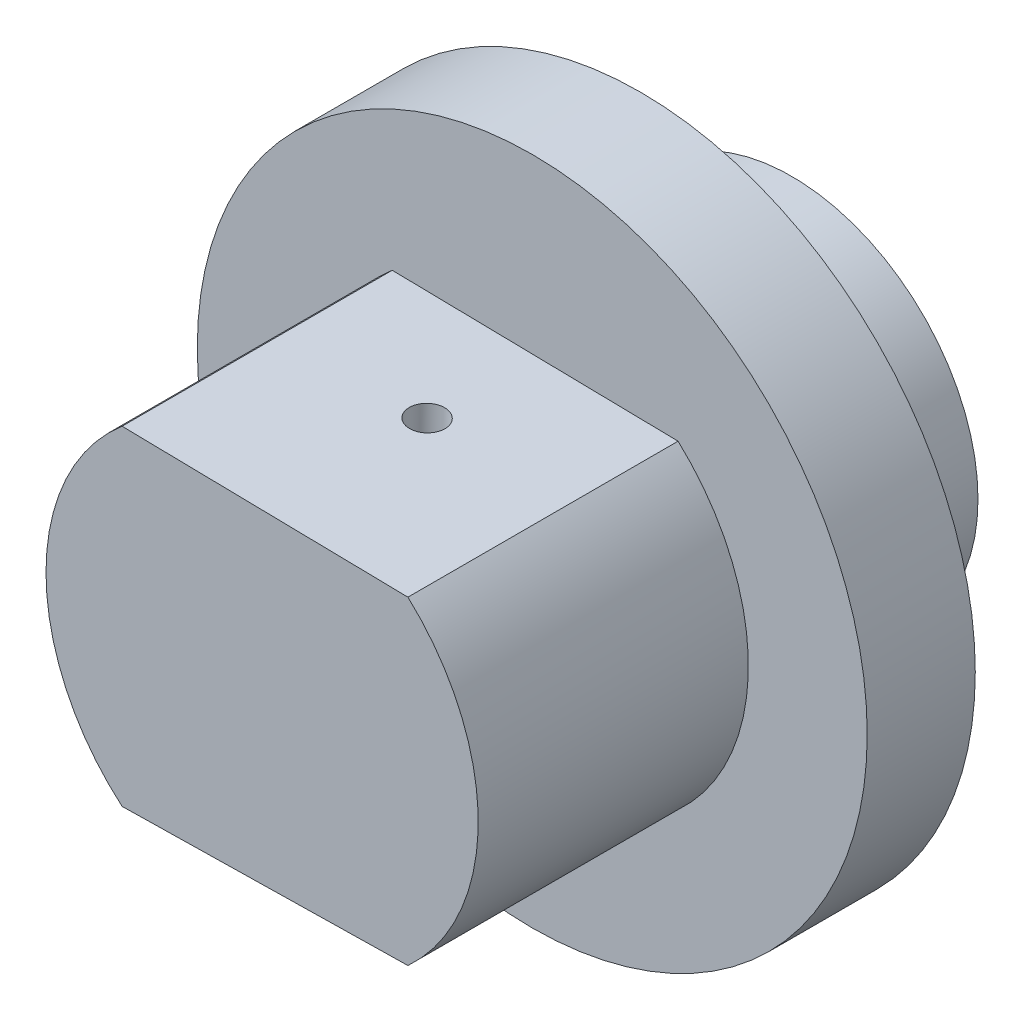
ISO-10303-21;
HEADER;
FILE_DESCRIPTION(('STEP AP214'),'2;1');
FILE_NAME('part.step','',(''),(''),'','','');
FILE_SCHEMA(('AUTOMOTIVE_DESIGN { 1 0 10303 214 1 1 1 1 }'));
ENDSEC;
DATA;
#1=APPLICATION_CONTEXT('core data for automotive mechanical design processes');
#2=APPLICATION_PROTOCOL_DEFINITION('international standard','automotive_design',2000,#1);
#3=PRODUCT_CONTEXT('',#1,'mechanical');
#4=PRODUCT('Part','Part','',(#3));
#5=PRODUCT_RELATED_PRODUCT_CATEGORY('part','',(#4));
#6=PRODUCT_DEFINITION_FORMATION('','',#4);
#7=PRODUCT_DEFINITION_CONTEXT('part definition',#1,'design');
#8=PRODUCT_DEFINITION('design','',#6,#7);
#9=PRODUCT_DEFINITION_SHAPE('','',#8);
#10=(LENGTH_UNIT() NAMED_UNIT(*) SI_UNIT(.MILLI.,.METRE.));
#11=(NAMED_UNIT(*) PLANE_ANGLE_UNIT() SI_UNIT($,.RADIAN.));
#12=(NAMED_UNIT(*) SI_UNIT($,.STERADIAN.) SOLID_ANGLE_UNIT());
#13=UNCERTAINTY_MEASURE_WITH_UNIT(LENGTH_MEASURE(1.E-05),#10,'distance_accuracy_value','');
#14=(GEOMETRIC_REPRESENTATION_CONTEXT(3) GLOBAL_UNCERTAINTY_ASSIGNED_CONTEXT((#13)) GLOBAL_UNIT_ASSIGNED_CONTEXT((#10,
#11,#12)) REPRESENTATION_CONTEXT('',''));
#15=CARTESIAN_POINT('',(0.,0.,0.));
#16=DIRECTION('',(0.,0.,1.));
#17=DIRECTION('',(1.,0.,0.));
#18=AXIS2_PLACEMENT_3D('',#15,#16,#17);
#19=CARTESIAN_POINT('',(0.,0.,14.));
#20=DIRECTION('',(0.,0.,-1.));
#21=DIRECTION('',(-1.,0.,0.));
#22=AXIS2_PLACEMENT_3D('',#19,#20,#21);
#23=CYLINDRICAL_SURFACE('',#22,17.25);
#24=CARTESIAN_POINT('',(0.,0.,14.));
#25=DIRECTION('',(0.,0.,1.));
#26=DIRECTION('',(1.,0.,0.));
#27=AXIS2_PLACEMENT_3D('',#24,#25,#26);
#28=CIRCLE('',#27,17.25);
#29=CARTESIAN_POINT('',(17.25,0.,14.));
#30=VERTEX_POINT('',#29);
#31=EDGE_CURVE('E11',#30,#30,#28,.T.);
#32=ORIENTED_EDGE('',*,*,#31,.F.);
#33=EDGE_LOOP('',(#32));
#34=FACE_BOUND('',#33,.T.);
#35=CARTESIAN_POINT('',(0.,0.,0.));
#36=DIRECTION('',(0.,0.,1.));
#37=DIRECTION('',(1.,0.,0.));
#38=AXIS2_PLACEMENT_3D('',#35,#36,#37);
#39=CIRCLE('',#38,17.25);
#40=CARTESIAN_POINT('',(17.25,0.,0.));
#41=VERTEX_POINT('',#40);
#42=EDGE_CURVE('E49',#41,#41,#39,.T.);
#43=ORIENTED_EDGE('',*,*,#42,.T.);
#44=EDGE_LOOP('',(#43));
#45=FACE_BOUND('',#44,.T.);
#46=ADVANCED_FACE('F41',(#34,#45),#23,.T.);
#47=CARTESIAN_POINT('',(0.,0.,0.));
#48=DIRECTION('',(0.,0.,1.));
#49=DIRECTION('',(1.,0.,0.));
#50=AXIS2_PLACEMENT_3D('',#47,#48,#49);
#51=PLANE('',#50);
#52=DIRECTION('',(-1.,0.,0.));
#53=VECTOR('',#52,1.);
#54=CARTESIAN_POINT('',(0.,10.5,0.));
#55=LINE('',#54,#53);
#56=CARTESIAN_POINT('',(10.5,10.5,0.));
#57=VERTEX_POINT('',#56);
#58=CARTESIAN_POINT('',(-10.5,10.5,0.));
#59=VERTEX_POINT('',#58);
#60=EDGE_CURVE('E174',#57,#59,#55,.T.);
#61=ORIENTED_EDGE('',*,*,#60,.T.);
#62=DIRECTION('',(0.,-1.,0.));
#63=VECTOR('',#62,1.);
#64=CARTESIAN_POINT('',(-10.5,0.,0.));
#65=LINE('',#64,#63);
#66=CARTESIAN_POINT('',(-10.5,-10.5,0.));
#67=VERTEX_POINT('',#66);
#68=EDGE_CURVE('E188',#59,#67,#65,.T.);
#69=ORIENTED_EDGE('',*,*,#68,.T.);
#70=DIRECTION('',(1.,0.,0.));
#71=VECTOR('',#70,1.);
#72=CARTESIAN_POINT('',(0.,-10.5,0.));
#73=LINE('',#72,#71);
#74=CARTESIAN_POINT('',(10.5,-10.5,0.));
#75=VERTEX_POINT('',#74);
#76=EDGE_CURVE('E185',#67,#75,#73,.T.);
#77=ORIENTED_EDGE('',*,*,#76,.T.);
#78=DIRECTION('',(0.,1.,0.));
#79=VECTOR('',#78,1.);
#80=CARTESIAN_POINT('',(10.5,0.,0.));
#81=LINE('',#80,#79);
#82=EDGE_CURVE('E182',#75,#57,#81,.T.);
#83=ORIENTED_EDGE('',*,*,#82,.T.);
#84=EDGE_LOOP('',(#61,#69,#77,#83));
#85=FACE_BOUND('',#84,.T.);
#86=ORIENTED_EDGE('',*,*,#42,.F.);
#87=EDGE_LOOP('',(#86));
#88=FACE_BOUND('',#87,.T.);
#89=ADVANCED_FACE('F200',(#85,#88),#51,.F.);
#90=CARTESIAN_POINT('',(0.,0.,24.));
#91=DIRECTION('',(0.,0.,-1.));
#92=DIRECTION('',(-1.,0.,0.));
#93=AXIS2_PLACEMENT_3D('',#90,#91,#92);
#94=CYLINDRICAL_SURFACE('',#93,31.);
#95=CARTESIAN_POINT('',(0.,0.,24.));
#96=DIRECTION('',(0.,0.,1.));
#97=DIRECTION('',(1.,0.,0.));
#98=AXIS2_PLACEMENT_3D('',#95,#96,#97);
#99=CIRCLE('',#98,31.);
#100=CARTESIAN_POINT('',(31.,0.,24.));
#101=VERTEX_POINT('',#100);
#102=EDGE_CURVE('E192',#101,#101,#99,.T.);
#103=ORIENTED_EDGE('',*,*,#102,.F.);
#104=EDGE_LOOP('',(#103));
#105=FACE_BOUND('',#104,.T.);
#106=CARTESIAN_POINT('',(0.,0.,14.));
#107=DIRECTION('',(0.,0.,1.));
#108=DIRECTION('',(1.,0.,0.));
#109=AXIS2_PLACEMENT_3D('',#106,#107,#108);
#110=CIRCLE('',#109,31.);
#111=CARTESIAN_POINT('',(31.,0.,14.));
#112=VERTEX_POINT('',#111);
#113=EDGE_CURVE('E191',#112,#112,#110,.T.);
#114=ORIENTED_EDGE('',*,*,#113,.T.);
#115=EDGE_LOOP('',(#114));
#116=FACE_BOUND('',#115,.T.);
#117=ADVANCED_FACE('F202',(#105,#116),#94,.T.);
#118=CARTESIAN_POINT('',(0.,0.,24.));
#119=DIRECTION('',(0.,0.,1.));
#120=DIRECTION('',(1.,0.,0.));
#121=AXIS2_PLACEMENT_3D('',#118,#119,#120);
#122=PLANE('',#121);
#123=CARTESIAN_POINT('',(0.,0.,24.));
#124=DIRECTION('',(0.,0.,1.));
#125=DIRECTION('',(1.,0.,0.));
#126=AXIS2_PLACEMENT_3D('',#123,#124,#125);
#127=CIRCLE('',#126,20.);
#128=CARTESIAN_POINT('',(-12.9596371870671,15.2331153734089,24.));
#129=VERTEX_POINT('',#128);
#130=CARTESIAN_POINT('',(-12.9596371870671,-15.2331153734089,24.));
#131=VERTEX_POINT('',#130);
#132=EDGE_CURVE('E65',#129,#131,#127,.T.);
#133=ORIENTED_EDGE('',*,*,#132,.F.);
#134=DIRECTION('',(-0.999841539985387,0.0178015426199193,0.));
#135=VECTOR('',#134,1.);
#136=CARTESIAN_POINT('',(-12.9596371870671,15.2331153734089,24.));
#137=LINE('',#136,#135);
#138=CARTESIAN_POINT('',(13.4936834656647,14.7621308261527,24.));
#139=VERTEX_POINT('',#138);
#140=EDGE_CURVE('E163',#139,#129,#137,.T.);
#141=ORIENTED_EDGE('',*,*,#140,.F.);
#142=CARTESIAN_POINT('',(0.,0.,24.));
#143=DIRECTION('',(0.,0.,1.));
#144=DIRECTION('',(1.,0.,0.));
#145=AXIS2_PLACEMENT_3D('',#142,#143,#144);
#146=CIRCLE('',#145,20.);
#147=CARTESIAN_POINT('',(13.4936834656647,-14.7621308261527,24.));
#148=VERTEX_POINT('',#147);
#149=EDGE_CURVE('E160',#148,#139,#146,.T.);
#150=ORIENTED_EDGE('',*,*,#149,.F.);
#151=DIRECTION('',(0.999841539985387,0.0178015426199193,0.));
#152=VECTOR('',#151,1.);
#153=CARTESIAN_POINT('',(-12.9596371870671,-15.2331153734089,24.));
#154=LINE('',#153,#152);
#155=EDGE_CURVE('E158',#131,#148,#154,.T.);
#156=ORIENTED_EDGE('',*,*,#155,.F.);
#157=EDGE_LOOP('',(#133,#141,#150,#156));
#158=FACE_BOUND('',#157,.T.);
#159=ORIENTED_EDGE('',*,*,#102,.T.);
#160=EDGE_LOOP('',(#159));
#161=FACE_BOUND('',#160,.T.);
#162=ADVANCED_FACE('F209',(#158,#161),#122,.T.);
#163=CARTESIAN_POINT('',(0.,0.,14.));
#164=DIRECTION('',(0.,0.,1.));
#165=DIRECTION('',(1.,0.,0.));
#166=AXIS2_PLACEMENT_3D('',#163,#164,#165);
#167=PLANE('',#166);
#168=ORIENTED_EDGE('',*,*,#31,.T.);
#169=EDGE_LOOP('',(#168));
#170=FACE_BOUND('',#169,.T.);
#171=ORIENTED_EDGE('',*,*,#113,.F.);
#172=EDGE_LOOP('',(#171));
#173=FACE_BOUND('',#172,.T.);
#174=ADVANCED_FACE('F215',(#170,#173),#167,.F.);
#175=CARTESIAN_POINT('',(-10.5,10.5,24.));
#176=DIRECTION('',(-1.,0.,0.));
#177=DIRECTION('',(0.,0.,1.));
#178=AXIS2_PLACEMENT_3D('',#175,#176,#177);
#179=PLANE('',#178);
#180=DIRECTION('',(0.,0.,-1.));
#181=VECTOR('',#180,1.);
#182=CARTESIAN_POINT('',(-10.5,10.5,24.));
#183=LINE('',#182,#181);
#184=CARTESIAN_POINT('',(-10.5,10.5,44.));
#185=VERTEX_POINT('',#184);
#186=EDGE_CURVE('E116',#185,#59,#183,.T.);
#187=ORIENTED_EDGE('',*,*,#186,.F.);
#188=DIRECTION('',(0.,1.,0.));
#189=VECTOR('',#188,1.);
#190=CARTESIAN_POINT('',(-10.5,10.5,44.));
#191=LINE('',#190,#189);
#192=CARTESIAN_POINT('',(-10.5,-10.5,44.));
#193=VERTEX_POINT('',#192);
#194=EDGE_CURVE('E145',#193,#185,#191,.T.);
#195=ORIENTED_EDGE('',*,*,#194,.F.);
#196=DIRECTION('',(0.,0.,-1.));
#197=VECTOR('',#196,1.);
#198=CARTESIAN_POINT('',(-10.5,-10.5,24.));
#199=LINE('',#198,#197);
#200=EDGE_CURVE('E171',#193,#67,#199,.T.);
#201=ORIENTED_EDGE('',*,*,#200,.T.);
#202=ORIENTED_EDGE('',*,*,#68,.F.);
#203=EDGE_LOOP('',(#187,#195,#201,#202));
#204=FACE_BOUND('',#203,.T.);
#205=ADVANCED_FACE('F217',(#204),#179,.F.);
#206=CARTESIAN_POINT('',(10.5,-10.5,24.));
#207=DIRECTION('',(0.,-1.,0.));
#208=DIRECTION('',(0.,0.,-1.));
#209=AXIS2_PLACEMENT_3D('',#206,#207,#208);
#210=PLANE('',#209);
#211=CARTESIAN_POINT('',(-0.18694582094667,-10.5,34.));
#212=DIRECTION('',(0.,-1.,0.));
#213=DIRECTION('',(1.,0.,0.));
#214=AXIS2_PLACEMENT_3D('',#211,#212,#213);
#215=ELLIPSE('',#214,1.65026150046148,1.65);
#216=CARTESIAN_POINT('',(1.46331567951481,-10.5,34.));
#217=VERTEX_POINT('',#216);
#218=EDGE_CURVE('E142',#217,#217,#215,.T.);
#219=ORIENTED_EDGE('',*,*,#218,.T.);
#220=EDGE_LOOP('',(#219));
#221=FACE_BOUND('',#220,.T.);
#222=ORIENTED_EDGE('',*,*,#200,.F.);
#223=DIRECTION('',(-1.,0.,0.));
#224=VECTOR('',#223,1.);
#225=CARTESIAN_POINT('',(10.5,-10.5,44.));
#226=LINE('',#225,#224);
#227=CARTESIAN_POINT('',(10.5,-10.5,44.));
#228=VERTEX_POINT('',#227);
#229=EDGE_CURVE('E154',#228,#193,#226,.T.);
#230=ORIENTED_EDGE('',*,*,#229,.F.);
#231=DIRECTION('',(0.,0.,-1.));
#232=VECTOR('',#231,1.);
#233=CARTESIAN_POINT('',(10.5,-10.5,24.));
#234=LINE('',#233,#232);
#235=EDGE_CURVE('E175',#228,#75,#234,.T.);
#236=ORIENTED_EDGE('',*,*,#235,.T.);
#237=ORIENTED_EDGE('',*,*,#76,.F.);
#238=EDGE_LOOP('',(#222,#230,#236,#237));
#239=FACE_BOUND('',#238,.T.);
#240=ADVANCED_FACE('F222',(#221,#239),#210,.F.);
#241=CARTESIAN_POINT('',(10.5,10.5,24.));
#242=DIRECTION('',(1.,0.,0.));
#243=DIRECTION('',(0.,1.,0.));
#244=AXIS2_PLACEMENT_3D('',#241,#242,#243);
#245=PLANE('',#244);
#246=ORIENTED_EDGE('',*,*,#235,.F.);
#247=DIRECTION('',(0.,-1.,0.));
#248=VECTOR('',#247,1.);
#249=CARTESIAN_POINT('',(10.5,10.5,44.));
#250=LINE('',#249,#248);
#251=CARTESIAN_POINT('',(10.5,10.5,44.));
#252=VERTEX_POINT('',#251);
#253=EDGE_CURVE('E151',#252,#228,#250,.T.);
#254=ORIENTED_EDGE('',*,*,#253,.F.);
#255=DIRECTION('',(0.,0.,-1.));
#256=VECTOR('',#255,1.);
#257=CARTESIAN_POINT('',(10.5,10.5,24.));
#258=LINE('',#257,#256);
#259=EDGE_CURVE('E57',#252,#57,#258,.T.);
#260=ORIENTED_EDGE('',*,*,#259,.T.);
#261=ORIENTED_EDGE('',*,*,#82,.F.);
#262=EDGE_LOOP('',(#246,#254,#260,#261));
#263=FACE_BOUND('',#262,.T.);
#264=ADVANCED_FACE('F228',(#263),#245,.F.);
#265=CARTESIAN_POINT('',(10.5,10.5,24.));
#266=DIRECTION('',(0.,1.,0.));
#267=DIRECTION('',(0.,0.,1.));
#268=AXIS2_PLACEMENT_3D('',#265,#266,#267);
#269=PLANE('',#268);
#270=CARTESIAN_POINT('',(0.186945820946673,10.5,34.));
#271=DIRECTION('',(0.,1.,0.));
#272=DIRECTION('',(1.,0.,0.));
#273=AXIS2_PLACEMENT_3D('',#270,#271,#272);
#274=ELLIPSE('',#273,1.65026150046148,1.65);
#275=CARTESIAN_POINT('',(1.83720732140815,10.5,34.));
#276=VERTEX_POINT('',#275);
#277=EDGE_CURVE('E139',#276,#276,#274,.T.);
#278=ORIENTED_EDGE('',*,*,#277,.T.);
#279=EDGE_LOOP('',(#278));
#280=FACE_BOUND('',#279,.T.);
#281=ORIENTED_EDGE('',*,*,#259,.F.);
#282=DIRECTION('',(1.,0.,0.));
#283=VECTOR('',#282,1.);
#284=CARTESIAN_POINT('',(10.5,10.5,44.));
#285=LINE('',#284,#283);
#286=EDGE_CURVE('E148',#185,#252,#285,.T.);
#287=ORIENTED_EDGE('',*,*,#286,.F.);
#288=ORIENTED_EDGE('',*,*,#186,.T.);
#289=ORIENTED_EDGE('',*,*,#60,.F.);
#290=EDGE_LOOP('',(#281,#287,#288,#289));
#291=FACE_BOUND('',#290,.T.);
#292=ADVANCED_FACE('F224',(#280,#291),#269,.F.);
#293=CARTESIAN_POINT('',(-12.9596371870671,15.2331153734089,44.));
#294=DIRECTION('',(-0.0178015426199193,-0.999841539985388,0.));
#295=DIRECTION('',(0.999841539985388,-0.0178015426199193,0.));
#296=AXIS2_PLACEMENT_3D('',#293,#294,#295);
#297=PLANE('',#296);
#298=CARTESIAN_POINT('',(0.267023139298792,14.9976230997808,34.));
#299=DIRECTION('',(0.0178015426199193,0.999841539985388,0.));
#300=DIRECTION('',(-0.999841539985388,0.0178015426199193,0.));
#301=AXIS2_PLACEMENT_3D('',#298,#299,#300);
#302=CIRCLE('',#301,1.65);
#303=CARTESIAN_POINT('',(-1.3827154016771,15.0269956451037,34.));
#304=VERTEX_POINT('',#303);
#305=EDGE_CURVE('E136',#304,#304,#302,.T.);
#306=ORIENTED_EDGE('',*,*,#305,.F.);
#307=EDGE_LOOP('',(#306));
#308=FACE_BOUND('',#307,.T.);
#309=ORIENTED_EDGE('',*,*,#140,.T.);
#310=DIRECTION('',(0.,0.,-1.));
#311=VECTOR('',#310,1.);
#312=CARTESIAN_POINT('',(-12.9596371870671,15.2331153734089,44.));
#313=LINE('',#312,#311);
#314=CARTESIAN_POINT('',(-12.9596371870671,15.2331153734089,49.));
#315=VERTEX_POINT('',#314);
#316=EDGE_CURVE('E165',#315,#129,#313,.T.);
#317=ORIENTED_EDGE('',*,*,#316,.F.);
#318=DIRECTION('',(-0.999841539985387,0.0178015426199193,0.));
#319=VECTOR('',#318,1.);
#320=CARTESIAN_POINT('',(13.4936834656647,14.7621308261527,49.));
#321=LINE('',#320,#319);
#322=CARTESIAN_POINT('',(13.4936834656647,14.7621308261527,49.));
#323=VERTEX_POINT('',#322);
#324=EDGE_CURVE('E131',#323,#315,#321,.T.);
#325=ORIENTED_EDGE('',*,*,#324,.F.);
#326=DIRECTION('',(0.,0.,-1.));
#327=VECTOR('',#326,1.);
#328=CARTESIAN_POINT('',(13.4936834656647,14.7621308261527,44.));
#329=LINE('',#328,#327);
#330=EDGE_CURVE('E167',#323,#139,#329,.T.);
#331=ORIENTED_EDGE('',*,*,#330,.T.);
#332=EDGE_LOOP('',(#309,#317,#325,#331));
#333=FACE_BOUND('',#332,.T.);
#334=ADVANCED_FACE('F227',(#308,#333),#297,.F.);
#335=CARTESIAN_POINT('',(0.,0.,44.));
#336=DIRECTION('',(0.,0.,-1.));
#337=DIRECTION('',(-1.,0.,0.));
#338=AXIS2_PLACEMENT_3D('',#335,#336,#337);
#339=CYLINDRICAL_SURFACE('',#338,20.);
#340=ORIENTED_EDGE('',*,*,#149,.T.);
#341=ORIENTED_EDGE('',*,*,#330,.F.);
#342=CARTESIAN_POINT('',(0.,0.,49.));
#343=DIRECTION('',(0.,0.,1.));
#344=DIRECTION('',(1.,0.,0.));
#345=AXIS2_PLACEMENT_3D('',#342,#343,#344);
#346=CIRCLE('',#345,20.);
#347=CARTESIAN_POINT('',(13.4936834656647,-14.7621308261527,49.));
#348=VERTEX_POINT('',#347);
#349=EDGE_CURVE('E126',#348,#323,#346,.T.);
#350=ORIENTED_EDGE('',*,*,#349,.F.);
#351=DIRECTION('',(0.,0.,-1.));
#352=VECTOR('',#351,1.);
#353=CARTESIAN_POINT('',(13.4936834656647,-14.7621308261527,44.));
#354=LINE('',#353,#352);
#355=EDGE_CURVE('E117',#348,#148,#354,.T.);
#356=ORIENTED_EDGE('',*,*,#355,.T.);
#357=EDGE_LOOP('',(#340,#341,#350,#356));
#358=FACE_BOUND('',#357,.T.);
#359=ADVANCED_FACE('F241',(#358),#339,.T.);
#360=CARTESIAN_POINT('',(-12.9596371870671,-15.2331153734089,44.));
#361=DIRECTION('',(-0.0178015426199193,0.999841539985388,0.));
#362=DIRECTION('',(-0.999841539985388,-0.0178015426199193,0.));
#363=AXIS2_PLACEMENT_3D('',#360,#361,#362);
#364=PLANE('',#363);
#365=CARTESIAN_POINT('',(-0.267192483179764,-15.0071344691243,34.));
#366=DIRECTION('',(-0.0178015426199193,0.999841539985388,0.));
#367=DIRECTION('',(0.999841539985388,0.0178015426199193,0.));
#368=AXIS2_PLACEMENT_3D('',#365,#366,#367);
#369=ELLIPSE('',#368,1.65104641644295,1.65);
#370=CARTESIAN_POINT('',(1.38359230842391,-14.9777432959745,34.));
#371=VERTEX_POINT('',#370);
#372=EDGE_CURVE('E44',#371,#371,#369,.T.);
#373=ORIENTED_EDGE('',*,*,#372,.T.);
#374=EDGE_LOOP('',(#373));
#375=FACE_BOUND('',#374,.T.);
#376=ORIENTED_EDGE('',*,*,#155,.T.);
#377=ORIENTED_EDGE('',*,*,#355,.F.);
#378=DIRECTION('',(0.999841539985387,0.0178015426199188,0.));
#379=VECTOR('',#378,1.);
#380=CARTESIAN_POINT('',(-12.9596371870671,-15.2331153734089,49.));
#381=LINE('',#380,#379);
#382=CARTESIAN_POINT('',(-12.9596371870671,-15.2331153734089,49.));
#383=VERTEX_POINT('',#382);
#384=EDGE_CURVE('E120',#383,#348,#381,.T.);
#385=ORIENTED_EDGE('',*,*,#384,.F.);
#386=DIRECTION('',(0.,0.,-1.));
#387=VECTOR('',#386,1.);
#388=CARTESIAN_POINT('',(-12.9596371870671,-15.2331153734089,44.));
#389=LINE('',#388,#387);
#390=EDGE_CURVE('E108',#383,#131,#389,.T.);
#391=ORIENTED_EDGE('',*,*,#390,.T.);
#392=EDGE_LOOP('',(#376,#377,#385,#391));
#393=FACE_BOUND('',#392,.T.);
#394=ADVANCED_FACE('F121',(#375,#393),#364,.F.);
#395=CARTESIAN_POINT('',(0.,0.,44.));
#396=DIRECTION('',(0.,0.,-1.));
#397=DIRECTION('',(-1.,0.,0.));
#398=AXIS2_PLACEMENT_3D('',#395,#396,#397);
#399=CYLINDRICAL_SURFACE('',#398,20.);
#400=ORIENTED_EDGE('',*,*,#132,.T.);
#401=ORIENTED_EDGE('',*,*,#390,.F.);
#402=CARTESIAN_POINT('',(0.,0.,49.));
#403=DIRECTION('',(0.,0.,1.));
#404=DIRECTION('',(1.,0.,0.));
#405=AXIS2_PLACEMENT_3D('',#402,#403,#404);
#406=CIRCLE('',#405,20.);
#407=EDGE_CURVE('E113',#315,#383,#406,.T.);
#408=ORIENTED_EDGE('',*,*,#407,.F.);
#409=ORIENTED_EDGE('',*,*,#316,.T.);
#410=EDGE_LOOP('',(#400,#401,#408,#409));
#411=FACE_BOUND('',#410,.T.);
#412=ADVANCED_FACE('F110',(#411),#399,.T.);
#413=CARTESIAN_POINT('',(-0.729863247416692,-40.9935031394009,34.));
#414=DIRECTION('',(0.0178015426199193,0.999841539985387,0.));
#415=DIRECTION('',(-0.999841539985387,0.0178015426199193,0.));
#416=AXIS2_PLACEMENT_3D('',#413,#414,#415);
#417=CYLINDRICAL_SURFACE('',#416,1.65);
#418=ORIENTED_EDGE('',*,*,#372,.F.);
#419=EDGE_LOOP('',(#418));
#420=FACE_BOUND('',#419,.T.);
#421=ORIENTED_EDGE('',*,*,#218,.F.);
#422=EDGE_LOOP('',(#421));
#423=FACE_BOUND('',#422,.T.);
#424=ADVANCED_FACE('F238',(#420,#423),#417,.F.);
#425=ORIENTED_EDGE('',*,*,#305,.T.);
#426=EDGE_LOOP('',(#425));
#427=FACE_BOUND('',#426,.T.);
#428=ORIENTED_EDGE('',*,*,#277,.F.);
#429=EDGE_LOOP('',(#428));
#430=FACE_BOUND('',#429,.T.);
#431=ADVANCED_FACE('F251',(#427,#430),#417,.F.);
#432=CARTESIAN_POINT('',(0.,0.,44.));
#433=DIRECTION('',(0.,0.,1.));
#434=DIRECTION('',(1.,0.,0.));
#435=AXIS2_PLACEMENT_3D('',#432,#433,#434);
#436=PLANE('',#435);
#437=ORIENTED_EDGE('',*,*,#229,.T.);
#438=ORIENTED_EDGE('',*,*,#194,.T.);
#439=ORIENTED_EDGE('',*,*,#286,.T.);
#440=ORIENTED_EDGE('',*,*,#253,.T.);
#441=EDGE_LOOP('',(#437,#438,#439,#440));
#442=FACE_BOUND('',#441,.T.);
#443=ADVANCED_FACE('F253',(#442),#436,.F.);
#444=CARTESIAN_POINT('',(0.,0.,49.));
#445=DIRECTION('',(0.,0.,1.));
#446=DIRECTION('',(1.,0.,0.));
#447=AXIS2_PLACEMENT_3D('',#444,#445,#446);
#448=PLANE('',#447);
#449=ORIENTED_EDGE('',*,*,#407,.T.);
#450=ORIENTED_EDGE('',*,*,#384,.T.);
#451=ORIENTED_EDGE('',*,*,#349,.T.);
#452=ORIENTED_EDGE('',*,*,#324,.T.);
#453=EDGE_LOOP('',(#449,#450,#451,#452));
#454=FACE_BOUND('',#453,.T.);
#455=ADVANCED_FACE('F129',(#454),#448,.T.);
#456=CLOSED_SHELL('',(#46,#89,#117,#162,#174,#205,#240,#264,#292,#334,#359,#394,#412,#424,#431,
#443,#455));
#457=MANIFOLD_SOLID_BREP('B2',#456);
#458=ADVANCED_BREP_SHAPE_REPRESENTATION('',(#18,#457),#14);
#459=SHAPE_DEFINITION_REPRESENTATION(#9,#458);
ENDSEC;
END-ISO-10303-21;
